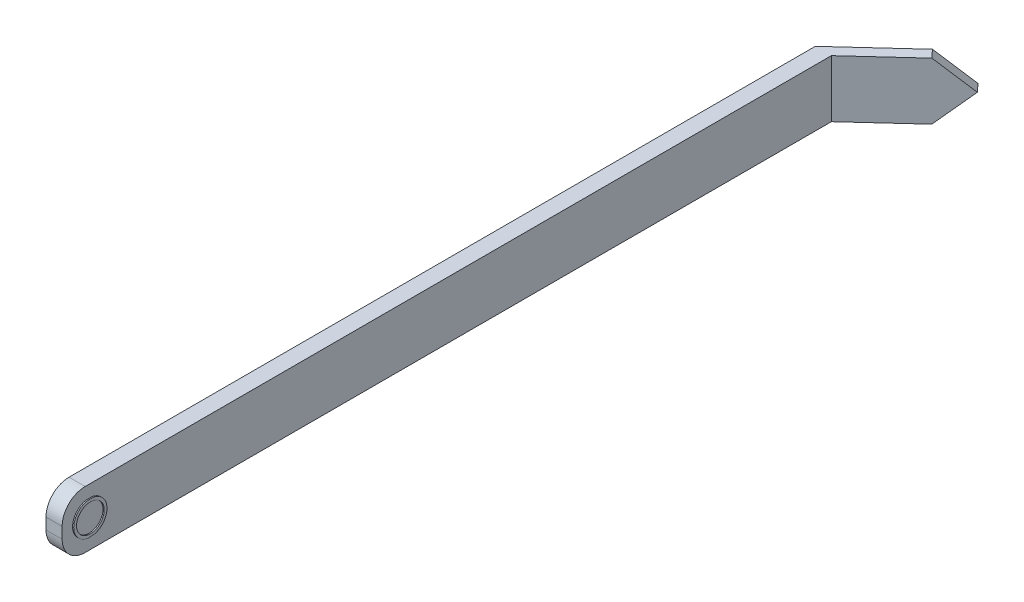
ISO-10303-21;
HEADER;
FILE_DESCRIPTION(('STEP AP214'),'2;1');
FILE_NAME('part.step','',(''),(''),'','','');
FILE_SCHEMA(('AUTOMOTIVE_DESIGN { 1 0 10303 214 1 1 1 1 }'));
ENDSEC;
DATA;
#1=APPLICATION_CONTEXT('core data for automotive mechanical design processes');
#2=APPLICATION_PROTOCOL_DEFINITION('international standard','automotive_design',2000,#1);
#3=PRODUCT_CONTEXT('',#1,'mechanical');
#4=PRODUCT('Part','Part','',(#3));
#5=PRODUCT_RELATED_PRODUCT_CATEGORY('part','',(#4));
#6=PRODUCT_DEFINITION_FORMATION('','',#4);
#7=PRODUCT_DEFINITION_CONTEXT('part definition',#1,'design');
#8=PRODUCT_DEFINITION('design','',#6,#7);
#9=PRODUCT_DEFINITION_SHAPE('','',#8);
#10=(LENGTH_UNIT() NAMED_UNIT(*) SI_UNIT(.MILLI.,.METRE.));
#11=(NAMED_UNIT(*) PLANE_ANGLE_UNIT() SI_UNIT($,.RADIAN.));
#12=(NAMED_UNIT(*) SI_UNIT($,.STERADIAN.) SOLID_ANGLE_UNIT());
#13=UNCERTAINTY_MEASURE_WITH_UNIT(LENGTH_MEASURE(1.E-05),#10,'distance_accuracy_value','');
#14=(GEOMETRIC_REPRESENTATION_CONTEXT(3) GLOBAL_UNCERTAINTY_ASSIGNED_CONTEXT((#13)) GLOBAL_UNIT_ASSIGNED_CONTEXT((#10,
#11,#12)) REPRESENTATION_CONTEXT('',''));
#15=CARTESIAN_POINT('',(0.,0.,0.));
#16=DIRECTION('',(0.,0.,1.));
#17=DIRECTION('',(1.,0.,0.));
#18=AXIS2_PLACEMENT_3D('',#15,#16,#17);
#19=CARTESIAN_POINT('',(3.49999999999998,6.21,-5.88));
#20=DIRECTION('',(-1.,0.,0.));
#21=DIRECTION('',(0.,-1.,0.));
#22=AXIS2_PLACEMENT_3D('',#19,#20,#21);
#23=PLANE('',#22);
#24=CARTESIAN_POINT('',(3.49999999999998,6.21,-5.88));
#25=DIRECTION('',(-1.,0.,0.));
#26=DIRECTION('',(0.,-1.,0.));
#27=AXIS2_PLACEMENT_3D('',#24,#25,#26);
#28=CIRCLE('',#27,3.61);
#29=CARTESIAN_POINT('',(3.49999999999998,2.62999999999999,-5.41556485921071));
#30=VERTEX_POINT('',#29);
#31=CARTESIAN_POINT('',(3.49999999999998,9.78999999999999,-5.41556485921069));
#32=VERTEX_POINT('',#31);
#33=EDGE_CURVE('E158',#30,#32,#28,.T.);
#34=ORIENTED_EDGE('',*,*,#33,.T.);
#35=DIRECTION('',(0.,-0.0596337664255842,-0.998220323326418));
#36=VECTOR('',#35,1.);
#37=CARTESIAN_POINT('',(3.49999999999998,9.74962212701801,-6.09145732482582));
#38=LINE('',#37,#36);
#39=CARTESIAN_POINT('',(3.49999999999998,9.70924425403603,-6.76734979044108));
#40=VERTEX_POINT('',#39);
#41=EDGE_CURVE('E153',#32,#40,#38,.T.);
#42=ORIENTED_EDGE('',*,*,#41,.T.);
#43=CARTESIAN_POINT('',(3.49999999999998,6.21,-5.88));
#44=DIRECTION('',(-1.,0.,0.));
#45=DIRECTION('',(0.,-1.,0.));
#46=AXIS2_PLACEMENT_3D('',#43,#44,#45);
#47=CIRCLE('',#46,3.61);
#48=CARTESIAN_POINT('',(3.49999999999998,2.71075574596396,-6.76734979044101));
#49=VERTEX_POINT('',#48);
#50=EDGE_CURVE('E156',#40,#49,#47,.T.);
#51=ORIENTED_EDGE('',*,*,#50,.T.);
#52=DIRECTION('',(0.,-0.0596337664255851,0.998220323326418));
#53=VECTOR('',#52,1.);
#54=CARTESIAN_POINT('',(3.49999999999998,2.67037787298197,-6.09145732482582));
#55=LINE('',#54,#53);
#56=EDGE_CURVE('E123',#49,#30,#55,.T.);
#57=ORIENTED_EDGE('',*,*,#56,.T.);
#58=EDGE_LOOP('',(#34,#42,#51,#57));
#59=FACE_BOUND('',#58,.T.);
#60=CARTESIAN_POINT('',(3.49999999999998,6.21,-5.88));
#61=DIRECTION('',(-1.,0.,0.));
#62=DIRECTION('',(0.,-1.,0.));
#63=AXIS2_PLACEMENT_3D('',#60,#61,#62);
#64=CIRCLE('',#63,3.);
#65=CARTESIAN_POINT('',(3.49999999999998,6.21,-8.88));
#66=VERTEX_POINT('',#65);
#67=EDGE_CURVE('E173',#66,#66,#64,.T.);
#68=ORIENTED_EDGE('',*,*,#67,.F.);
#69=EDGE_LOOP('',(#68));
#70=FACE_BOUND('',#69,.T.);
#71=ADVANCED_FACE('F106',(#59,#70),#23,.T.);
#72=CARTESIAN_POINT('',(3.74999999999998,6.21,-5.88));
#73=DIRECTION('',(-1.,0.,0.));
#74=DIRECTION('',(0.,-1.,0.));
#75=AXIS2_PLACEMENT_3D('',#72,#73,#74);
#76=PLANE('',#75);
#77=CARTESIAN_POINT('',(3.74999999999998,6.21,-5.88));
#78=DIRECTION('',(-1.,0.,0.));
#79=DIRECTION('',(0.,-1.,0.));
#80=AXIS2_PLACEMENT_3D('',#77,#78,#79);
#81=CIRCLE('',#80,3.61);
#82=CARTESIAN_POINT('',(3.74999999999998,2.62999999999999,-5.41556485921071));
#83=VERTEX_POINT('',#82);
#84=CARTESIAN_POINT('',(3.74999999999998,9.78999999999999,-5.41556485921069));
#85=VERTEX_POINT('',#84);
#86=EDGE_CURVE('E170',#83,#85,#81,.T.);
#87=ORIENTED_EDGE('',*,*,#86,.F.);
#88=DIRECTION('',(0.,-0.0596337664255851,0.998220323326418));
#89=VECTOR('',#88,1.);
#90=CARTESIAN_POINT('',(3.74999999999998,2.67037787298197,-6.09145732482582));
#91=LINE('',#90,#89);
#92=CARTESIAN_POINT('',(3.74999999999998,2.71075574596396,-6.76734979044101));
#93=VERTEX_POINT('',#92);
#94=EDGE_CURVE('E146',#93,#83,#91,.T.);
#95=ORIENTED_EDGE('',*,*,#94,.F.);
#96=CARTESIAN_POINT('',(3.74999999999998,6.21,-5.88));
#97=DIRECTION('',(-1.,0.,0.));
#98=DIRECTION('',(0.,-1.,0.));
#99=AXIS2_PLACEMENT_3D('',#96,#97,#98);
#100=CIRCLE('',#99,3.61);
#101=CARTESIAN_POINT('',(3.74999999999998,9.70924425403603,-6.76734979044108));
#102=VERTEX_POINT('',#101);
#103=EDGE_CURVE('E140',#102,#93,#100,.T.);
#104=ORIENTED_EDGE('',*,*,#103,.F.);
#105=DIRECTION('',(0.,-0.0596337664255842,-0.998220323326418));
#106=VECTOR('',#105,1.);
#107=CARTESIAN_POINT('',(3.74999999999998,9.74962212701801,-6.09145732482582));
#108=LINE('',#107,#106);
#109=EDGE_CURVE('E162',#85,#102,#108,.T.);
#110=ORIENTED_EDGE('',*,*,#109,.F.);
#111=EDGE_LOOP('',(#87,#95,#104,#110));
#112=FACE_BOUND('',#111,.T.);
#113=CARTESIAN_POINT('',(3.74999999999998,6.21,-5.88));
#114=DIRECTION('',(-1.,0.,0.));
#115=DIRECTION('',(0.,-1.,0.));
#116=AXIS2_PLACEMENT_3D('',#113,#114,#115);
#117=CIRCLE('',#116,3.);
#118=CARTESIAN_POINT('',(3.74999999999998,6.21,-8.88));
#119=VERTEX_POINT('',#118);
#120=EDGE_CURVE('E185',#119,#119,#117,.T.);
#121=ORIENTED_EDGE('',*,*,#120,.T.);
#122=EDGE_LOOP('',(#121));
#123=FACE_BOUND('',#122,.T.);
#124=ADVANCED_FACE('F181',(#112,#123),#76,.F.);
#125=CARTESIAN_POINT('',(3.49999999999998,6.21,-5.88));
#126=DIRECTION('',(1.,0.,0.));
#127=DIRECTION('',(0.,0.,-1.));
#128=AXIS2_PLACEMENT_3D('',#125,#126,#127);
#129=CYLINDRICAL_SURFACE('',#128,3.61);
#130=ORIENTED_EDGE('',*,*,#86,.T.);
#131=DIRECTION('',(1.,0.,0.));
#132=VECTOR('',#131,1.);
#133=CARTESIAN_POINT('',(3.49999999999998,9.78999999999999,-5.41556485921069));
#134=LINE('',#133,#132);
#135=EDGE_CURVE('E13',#32,#85,#134,.T.);
#136=ORIENTED_EDGE('',*,*,#135,.F.);
#137=ORIENTED_EDGE('',*,*,#33,.F.);
#138=DIRECTION('',(1.,0.,0.));
#139=VECTOR('',#138,1.);
#140=CARTESIAN_POINT('',(3.49999999999998,2.62999999999999,-5.41556485921071));
#141=LINE('',#140,#139);
#142=EDGE_CURVE('E166',#30,#83,#141,.T.);
#143=ORIENTED_EDGE('',*,*,#142,.T.);
#144=EDGE_LOOP('',(#130,#136,#137,#143));
#145=FACE_BOUND('',#144,.T.);
#146=ADVANCED_FACE('F108',(#145),#129,.T.);
#147=CARTESIAN_POINT('',(3.49999999999998,9.74962212701801,-6.09145732482582));
#148=DIRECTION('',(0.,-0.998220323326418,0.0596337664255842));
#149=DIRECTION('',(0.,-0.0596337664255842,-0.998220323326418));
#150=AXIS2_PLACEMENT_3D('',#147,#148,#149);
#151=PLANE('',#150);
#152=ORIENTED_EDGE('',*,*,#109,.T.);
#153=DIRECTION('',(1.,0.,0.));
#154=VECTOR('',#153,1.);
#155=CARTESIAN_POINT('',(3.49999999999998,9.70924425403603,-6.76734979044108));
#156=LINE('',#155,#154);
#157=EDGE_CURVE('E115',#40,#102,#156,.T.);
#158=ORIENTED_EDGE('',*,*,#157,.F.);
#159=ORIENTED_EDGE('',*,*,#41,.F.);
#160=ORIENTED_EDGE('',*,*,#135,.T.);
#161=EDGE_LOOP('',(#152,#158,#159,#160));
#162=FACE_BOUND('',#161,.T.);
#163=ADVANCED_FACE('F161',(#162),#151,.F.);
#164=CARTESIAN_POINT('',(3.49999999999998,6.21,-5.88));
#165=DIRECTION('',(1.,0.,0.));
#166=DIRECTION('',(0.,0.,-1.));
#167=AXIS2_PLACEMENT_3D('',#164,#165,#166);
#168=CYLINDRICAL_SURFACE('',#167,3.61);
#169=ORIENTED_EDGE('',*,*,#103,.T.);
#170=DIRECTION('',(1.,0.,0.));
#171=VECTOR('',#170,1.);
#172=CARTESIAN_POINT('',(3.49999999999998,2.71075574596396,-6.76734979044101));
#173=LINE('',#172,#171);
#174=EDGE_CURVE('E163',#49,#93,#173,.T.);
#175=ORIENTED_EDGE('',*,*,#174,.F.);
#176=ORIENTED_EDGE('',*,*,#50,.F.);
#177=ORIENTED_EDGE('',*,*,#157,.T.);
#178=EDGE_LOOP('',(#169,#175,#176,#177));
#179=FACE_BOUND('',#178,.T.);
#180=ADVANCED_FACE('F164',(#179),#168,.T.);
#181=CARTESIAN_POINT('',(3.49999999999998,2.67037787298197,-6.09145732482582));
#182=DIRECTION('',(0.,0.998220323326418,0.0596337664255851));
#183=DIRECTION('',(0.,-0.0596337664255851,0.998220323326418));
#184=AXIS2_PLACEMENT_3D('',#181,#182,#183);
#185=PLANE('',#184);
#186=ORIENTED_EDGE('',*,*,#94,.T.);
#187=ORIENTED_EDGE('',*,*,#142,.F.);
#188=ORIENTED_EDGE('',*,*,#56,.F.);
#189=ORIENTED_EDGE('',*,*,#174,.T.);
#190=EDGE_LOOP('',(#186,#187,#188,#189));
#191=FACE_BOUND('',#190,.T.);
#192=ADVANCED_FACE('F178',(#191),#185,.F.);
#193=CARTESIAN_POINT('',(3.49999999999998,6.21,-5.88));
#194=DIRECTION('',(1.,0.,0.));
#195=DIRECTION('',(0.,0.,-1.));
#196=AXIS2_PLACEMENT_3D('',#193,#194,#195);
#197=CYLINDRICAL_SURFACE('',#196,3.);
#198=CARTESIAN_POINT('',(3.49999999999998,6.21,-8.88));
#199=CARTESIAN_POINT('',(3.50260416666665,6.21,-8.88));
#200=CARTESIAN_POINT('',(3.50520833333332,6.21,-8.88));
#201=CARTESIAN_POINT('',(3.51041666666665,6.21,-8.88));
#202=CARTESIAN_POINT('',(3.51302083333332,6.21,-8.88));
#203=CARTESIAN_POINT('',(3.51822916666665,6.21,-8.88));
#204=CARTESIAN_POINT('',(3.52083333333332,6.21,-8.88));
#205=CARTESIAN_POINT('',(3.52604166666665,6.21,-8.88));
#206=CARTESIAN_POINT('',(3.52864583333332,6.21,-8.88));
#207=CARTESIAN_POINT('',(3.53385416666665,6.21,-8.88));
#208=CARTESIAN_POINT('',(3.53645833333332,6.21,-8.88));
#209=CARTESIAN_POINT('',(3.54166666666665,6.21,-8.88));
#210=CARTESIAN_POINT('',(3.54427083333332,6.21,-8.88));
#211=CARTESIAN_POINT('',(3.54947916666665,6.21,-8.88));
#212=CARTESIAN_POINT('',(3.55208333333332,6.21,-8.88));
#213=CARTESIAN_POINT('',(3.55729166666665,6.21,-8.88));
#214=CARTESIAN_POINT('',(3.55989583333332,6.21,-8.88));
#215=CARTESIAN_POINT('',(3.56510416666665,6.21,-8.88));
#216=CARTESIAN_POINT('',(3.56770833333332,6.21,-8.88));
#217=CARTESIAN_POINT('',(3.57291666666665,6.21,-8.88));
#218=CARTESIAN_POINT('',(3.57552083333332,6.21,-8.88));
#219=CARTESIAN_POINT('',(3.58072916666665,6.21,-8.88));
#220=CARTESIAN_POINT('',(3.58333333333332,6.21,-8.88));
#221=CARTESIAN_POINT('',(3.58854166666665,6.21,-8.88));
#222=CARTESIAN_POINT('',(3.59114583333332,6.21,-8.88));
#223=CARTESIAN_POINT('',(3.59635416666665,6.21,-8.88));
#224=CARTESIAN_POINT('',(3.59895833333332,6.21,-8.88));
#225=CARTESIAN_POINT('',(3.60416666666665,6.21,-8.88));
#226=CARTESIAN_POINT('',(3.60677083333332,6.21,-8.88));
#227=CARTESIAN_POINT('',(3.61197916666665,6.21,-8.88));
#228=CARTESIAN_POINT('',(3.61458333333332,6.21,-8.88));
#229=CARTESIAN_POINT('',(3.61979166666665,6.21,-8.88));
#230=CARTESIAN_POINT('',(3.62239583333332,6.21,-8.88));
#231=CARTESIAN_POINT('',(3.62760416666665,6.21,-8.88));
#232=CARTESIAN_POINT('',(3.63020833333332,6.21,-8.88));
#233=CARTESIAN_POINT('',(3.63541666666665,6.21,-8.88));
#234=CARTESIAN_POINT('',(3.63802083333332,6.21,-8.88));
#235=CARTESIAN_POINT('',(3.64322916666665,6.21,-8.88));
#236=CARTESIAN_POINT('',(3.64583333333332,6.21,-8.88));
#237=CARTESIAN_POINT('',(3.65104166666665,6.21,-8.88));
#238=CARTESIAN_POINT('',(3.65364583333332,6.21,-8.88));
#239=CARTESIAN_POINT('',(3.65885416666665,6.21,-8.88));
#240=CARTESIAN_POINT('',(3.66145833333332,6.21,-8.88));
#241=CARTESIAN_POINT('',(3.66666666666665,6.21,-8.88));
#242=CARTESIAN_POINT('',(3.66927083333332,6.21,-8.88));
#243=CARTESIAN_POINT('',(3.67447916666665,6.21,-8.88));
#244=CARTESIAN_POINT('',(3.67708333333332,6.21,-8.88));
#245=CARTESIAN_POINT('',(3.68229166666665,6.21,-8.88));
#246=CARTESIAN_POINT('',(3.68489583333332,6.21,-8.88));
#247=CARTESIAN_POINT('',(3.69010416666665,6.21,-8.88));
#248=CARTESIAN_POINT('',(3.69270833333332,6.21,-8.88));
#249=CARTESIAN_POINT('',(3.69791666666665,6.21,-8.88));
#250=CARTESIAN_POINT('',(3.70052083333332,6.21,-8.88));
#251=CARTESIAN_POINT('',(3.70572916666665,6.21,-8.88));
#252=CARTESIAN_POINT('',(3.70833333333332,6.21,-8.88));
#253=CARTESIAN_POINT('',(3.71354166666665,6.21,-8.88));
#254=CARTESIAN_POINT('',(3.71614583333332,6.21,-8.88));
#255=CARTESIAN_POINT('',(3.72135416666665,6.21,-8.88));
#256=CARTESIAN_POINT('',(3.72395833333332,6.21,-8.88));
#257=CARTESIAN_POINT('',(3.72916666666665,6.21,-8.88));
#258=CARTESIAN_POINT('',(3.73177083333332,6.21,-8.88));
#259=CARTESIAN_POINT('',(3.73697916666665,6.21,-8.88));
#260=CARTESIAN_POINT('',(3.73958333333332,6.21,-8.88));
#261=CARTESIAN_POINT('',(3.74479166666665,6.21,-8.88));
#262=CARTESIAN_POINT('',(3.74739583333332,6.21,-8.88));
#263=CARTESIAN_POINT('',(3.74999999999998,6.21,-8.88));
#264=B_SPLINE_CURVE_WITH_KNOTS('',3,(#198,#199,#200,#201,#202,#203,#204,#205,#206,#207,#208,
#209,#210,#211,#212,#213,#214,#215,#216,#217,#218,#219,#220,#221,#222,#223,#224,#225,#226,#227,
#228,#229,#230,#231,#232,#233,#234,#235,#236,#237,#238,#239,#240,#241,#242,#243,#244,#245,#246,
#247,#248,#249,#250,#251,#252,#253,#254,#255,#256,#257,#258,#259,#260,#261,#262,#263),
.UNSPECIFIED.,.F.,.F.,(4,2,2,2,2,2,2,2,2,2,2,2,2,2,2,2,2,2,2,2,2,2,2,2,2,2,2,2,2,2,2,2,4),(0.,
0.00781250000000044,0.0156250000000004,0.0234375000000005,0.0312500000000005,0.0390625000000005,
0.0468750000000005,0.0546875000000005,0.0625000000000005,0.0703125000000005,0.0781250000000005,
0.0859375000000005,0.0937500000000005,0.101562500000001,0.109375000000001,0.117187500000001,
0.125000000000001,0.132812500000001,0.140625000000001,0.148437500000001,0.156250000000001,
0.164062500000001,0.171875000000001,0.179687500000001,0.187500000000001,0.195312500000001,
0.203125000000001,0.210937500000001,0.218750000000001,0.226562500000001,0.234375000000001,
0.242187500000001,0.250000000000001),.UNSPECIFIED.);
#265=EDGE_CURVE('BSEAM191',#66,#119,#264,.T.);
#266=ORIENTED_EDGE('',*,*,#67,.T.);
#267=ORIENTED_EDGE('',*,*,#120,.F.);
#268=ORIENTED_EDGE('',*,*,#265,.T.);
#269=ORIENTED_EDGE('',*,*,#265,.F.);
#270=EDGE_LOOP('',(#266,#268,#267,#269));
#271=FACE_BOUND('',#270,.T.);
#272=ADVANCED_FACE('F191',(#271),#197,.F.);
#273=CLOSED_SHELL('',(#71,#124,#146,#163,#180,#192,#272));
#274=MANIFOLD_SOLID_BREP('B2',#273);
#275=CARTESIAN_POINT('',(3.5,0.,0.));
#276=DIRECTION('',(0.,1.,0.));
#277=DIRECTION('',(0.,0.,1.));
#278=AXIS2_PLACEMENT_3D('',#275,#276,#277);
#279=PLANE('',#278);
#280=DIRECTION('',(-0.737041466427065,0.,0.67584752479168));
#281=VECTOR('',#280,1.);
#282=CARTESIAN_POINT('',(18.4260366606766,0.,-183.896188119792));
#283=LINE('',#282,#281);
#284=CARTESIAN_POINT('',(13.2667463956872,0.,-179.16525544625));
#285=VERTEX_POINT('',#284);
#286=CARTESIAN_POINT('',(0.,0.,-167.));
#287=VERTEX_POINT('',#286);
#288=EDGE_CURVE('E486',#285,#287,#283,.T.);
#289=ORIENTED_EDGE('',*,*,#288,.F.);
#290=DIRECTION('',(-0.67584752479168,0.,-0.737041466427066));
#291=VECTOR('',#290,1.);
#292=CARTESIAN_POINT('',(105.600758087461,0.,-78.4709525420927));
#293=LINE('',#292,#291);
#294=CARTESIAN_POINT('',(14.8654409643718,0.,-177.421808668613));
#295=VERTEX_POINT('',#294);
#296=EDGE_CURVE('E393',#295,#285,#293,.T.);
#297=ORIENTED_EDGE('',*,*,#296,.F.);
#298=DIRECTION('',(0.737041466427065,0.,-0.67584752479168));
#299=VECTOR('',#298,1.);
#300=CARTESIAN_POINT('',(3.5,0.,-167.));
#301=LINE('',#300,#299);
#302=CARTESIAN_POINT('',(3.5,0.,-167.));
#303=VERTEX_POINT('',#302);
#304=EDGE_CURVE('E392',#303,#295,#301,.T.);
#305=ORIENTED_EDGE('',*,*,#304,.F.);
#306=DIRECTION('',(0.,0.,-1.));
#307=VECTOR('',#306,1.);
#308=CARTESIAN_POINT('',(3.5,0.,0.));
#309=LINE('',#308,#307);
#310=CARTESIAN_POINT('',(3.5,0.,-5.));
#311=VERTEX_POINT('',#310);
#312=EDGE_CURVE('E501',#311,#303,#309,.T.);
#313=ORIENTED_EDGE('',*,*,#312,.F.);
#314=DIRECTION('',(-1.,0.,0.));
#315=VECTOR('',#314,1.);
#316=CARTESIAN_POINT('',(0.,0.,-5.));
#317=LINE('',#316,#315);
#318=CARTESIAN_POINT('',(0.,0.,-5.));
#319=VERTEX_POINT('',#318);
#320=EDGE_CURVE('E546',#311,#319,#317,.T.);
#321=ORIENTED_EDGE('',*,*,#320,.T.);
#322=DIRECTION('',(0.,0.,-1.));
#323=VECTOR('',#322,1.);
#324=CARTESIAN_POINT('',(0.,0.,0.));
#325=LINE('',#324,#323);
#326=EDGE_CURVE('E505',#319,#287,#325,.T.);
#327=ORIENTED_EDGE('',*,*,#326,.T.);
#328=EDGE_LOOP('',(#289,#297,#305,#313,#321,#327));
#329=FACE_BOUND('',#328,.T.);
#330=ADVANCED_FACE('F259',(#329),#279,.F.);
#331=CARTESIAN_POINT('',(3.5,12.42,0.));
#332=DIRECTION('',(0.,1.,0.));
#333=DIRECTION('',(0.,0.,1.));
#334=AXIS2_PLACEMENT_3D('',#331,#332,#333);
#335=PLANE('',#334);
#336=DIRECTION('',(-0.67584752479168,0.,-0.737041466427066));
#337=VECTOR('',#336,1.);
#338=CARTESIAN_POINT('',(105.600758087461,12.42,-78.4709525420926));
#339=LINE('',#338,#337);
#340=CARTESIAN_POINT('',(14.8654409643718,12.42,-177.421808668613));
#341=VERTEX_POINT('',#340);
#342=CARTESIAN_POINT('',(13.2667463956871,12.42,-179.16525544625));
#343=VERTEX_POINT('',#342);
#344=EDGE_CURVE('E273',#341,#343,#339,.T.);
#345=ORIENTED_EDGE('',*,*,#344,.T.);
#346=DIRECTION('',(-0.737041466427065,0.,0.67584752479168));
#347=VECTOR('',#346,1.);
#348=CARTESIAN_POINT('',(18.4260366606766,12.42,-183.896188119792));
#349=LINE('',#348,#347);
#350=CARTESIAN_POINT('',(0.,12.42,-167.));
#351=VERTEX_POINT('',#350);
#352=EDGE_CURVE('E485',#343,#351,#349,.T.);
#353=ORIENTED_EDGE('',*,*,#352,.T.);
#354=DIRECTION('',(0.,0.,-1.));
#355=VECTOR('',#354,1.);
#356=CARTESIAN_POINT('',(0.,12.42,0.));
#357=LINE('',#356,#355);
#358=CARTESIAN_POINT('',(0.,12.42,-5.));
#359=VERTEX_POINT('',#358);
#360=EDGE_CURVE('E491',#359,#351,#357,.T.);
#361=ORIENTED_EDGE('',*,*,#360,.F.);
#362=DIRECTION('',(-1.,0.,0.));
#363=VECTOR('',#362,1.);
#364=CARTESIAN_POINT('',(3.5,12.42,-5.));
#365=LINE('',#364,#363);
#366=CARTESIAN_POINT('',(3.5,12.42,-5.));
#367=VERTEX_POINT('',#366);
#368=EDGE_CURVE('E540',#359,#367,#365,.F.);
#369=ORIENTED_EDGE('',*,*,#368,.T.);
#370=DIRECTION('',(0.,0.,-1.));
#371=VECTOR('',#370,1.);
#372=CARTESIAN_POINT('',(3.5,12.42,0.));
#373=LINE('',#372,#371);
#374=CARTESIAN_POINT('',(3.5,12.42,-167.));
#375=VERTEX_POINT('',#374);
#376=EDGE_CURVE('E507',#367,#375,#373,.T.);
#377=ORIENTED_EDGE('',*,*,#376,.T.);
#378=DIRECTION('',(0.737041466427065,0.,-0.67584752479168));
#379=VECTOR('',#378,1.);
#380=CARTESIAN_POINT('',(3.5,12.42,-167.));
#381=LINE('',#380,#379);
#382=EDGE_CURVE('E591',#375,#341,#381,.T.);
#383=ORIENTED_EDGE('',*,*,#382,.T.);
#384=EDGE_LOOP('',(#345,#353,#361,#369,#377,#383));
#385=FACE_BOUND('',#384,.T.);
#386=ADVANCED_FACE('F408',(#385),#335,.T.);
#387=CARTESIAN_POINT('',(3.5,0.,0.));
#388=DIRECTION('',(1.,0.,0.));
#389=DIRECTION('',(0.,0.,-1.));
#390=AXIS2_PLACEMENT_3D('',#387,#388,#389);
#391=PLANE('',#390);
#392=DIRECTION('',(0.,-0.0596337664255842,-0.998220323326418));
#393=VECTOR('',#392,1.);
#394=CARTESIAN_POINT('',(3.5,10.0775607204516,-0.602034328594348));
#395=LINE('',#394,#393);
#396=CARTESIAN_POINT('',(3.5,9.78999999999999,-5.41556485921069));
#397=VERTEX_POINT('',#396);
#398=CARTESIAN_POINT('',(3.5,9.72280735048438,-6.54031468376415));
#399=VERTEX_POINT('',#398);
#400=EDGE_CURVE('E512',#397,#399,#395,.T.);
#401=ORIENTED_EDGE('',*,*,#400,.T.);
#402=CARTESIAN_POINT('',(3.5,7.72636670383154,-6.42104715091298));
#403=DIRECTION('',(1.,0.,0.));
#404=DIRECTION('',(0.,0.,-1.));
#405=AXIS2_PLACEMENT_3D('',#402,#403,#404);
#406=CIRCLE('',#405,2.);
#407=CARTESIAN_POINT('',(3.5,9.61005205020613,-7.09315541291669));
#408=VERTEX_POINT('',#407);
#409=EDGE_CURVE('E474',#399,#408,#406,.F.);
#410=ORIENTED_EDGE('',*,*,#409,.T.);
#411=CARTESIAN_POINT('',(3.5,6.21,-5.88));
#412=DIRECTION('',(-1.,0.,0.));
#413=DIRECTION('',(0.,0.,1.));
#414=AXIS2_PLACEMENT_3D('',#411,#412,#413);
#415=CIRCLE('',#414,3.61);
#416=CARTESIAN_POINT('',(3.5,2.80994794979383,-7.09315541291659));
#417=VERTEX_POINT('',#416);
#418=EDGE_CURVE('E529',#408,#417,#415,.T.);
#419=ORIENTED_EDGE('',*,*,#418,.T.);
#420=CARTESIAN_POINT('',(3.5,4.69363329616844,-6.42104715091294));
#421=DIRECTION('',(1.,0.,0.));
#422=DIRECTION('',(0.,0.,-1.));
#423=AXIS2_PLACEMENT_3D('',#420,#421,#422);
#424=CIRCLE('',#423,2.);
#425=CARTESIAN_POINT('',(3.5,2.69719264951561,-6.54031468376411));
#426=VERTEX_POINT('',#425);
#427=EDGE_CURVE('E464',#417,#426,#424,.F.);
#428=ORIENTED_EDGE('',*,*,#427,.T.);
#429=DIRECTION('',(0.,-0.0596337664255851,0.998220323326418));
#430=VECTOR('',#429,1.);
#431=CARTESIAN_POINT('',(3.5,2.29827144820995,0.137298930428936));
#432=LINE('',#431,#430);
#433=CARTESIAN_POINT('',(3.5,2.62999999999999,-5.41556485921071));
#434=VERTEX_POINT('',#433);
#435=EDGE_CURVE('E527',#426,#434,#432,.T.);
#436=ORIENTED_EDGE('',*,*,#435,.T.);
#437=EDGE_CURVE('E517',#434,#397,#415,.T.);
#438=ORIENTED_EDGE('',*,*,#437,.T.);
#439=EDGE_LOOP('',(#401,#410,#419,#428,#436,#438));
#440=FACE_BOUND('',#439,.T.);
#441=ORIENTED_EDGE('',*,*,#312,.T.);
#442=DIRECTION('',(0.,1.,0.));
#443=VECTOR('',#442,1.);
#444=CARTESIAN_POINT('',(3.5,0.,-167.));
#445=LINE('',#444,#443);
#446=EDGE_CURVE('E567',#303,#375,#445,.T.);
#447=ORIENTED_EDGE('',*,*,#446,.T.);
#448=ORIENTED_EDGE('',*,*,#376,.F.);
#449=CARTESIAN_POINT('',(3.5,7.42,-5.));
#450=DIRECTION('',(1.,0.,0.));
#451=DIRECTION('',(0.,0.,-1.));
#452=AXIS2_PLACEMENT_3D('',#449,#450,#451);
#453=CIRCLE('',#452,5.);
#454=CARTESIAN_POINT('',(3.5,7.42,0.));
#455=VERTEX_POINT('',#454);
#456=EDGE_CURVE('E544',#367,#455,#453,.T.);
#457=ORIENTED_EDGE('',*,*,#456,.T.);
#458=DIRECTION('',(0.,1.,0.));
#459=VECTOR('',#458,1.);
#460=CARTESIAN_POINT('',(3.5,0.,0.));
#461=LINE('',#460,#459);
#462=CARTESIAN_POINT('',(3.5,5.,0.));
#463=VERTEX_POINT('',#462);
#464=EDGE_CURVE('E509',#463,#455,#461,.T.);
#465=ORIENTED_EDGE('',*,*,#464,.F.);
#466=CARTESIAN_POINT('',(3.5,5.,-5.));
#467=DIRECTION('',(1.,0.,0.));
#468=DIRECTION('',(0.,0.,-1.));
#469=AXIS2_PLACEMENT_3D('',#466,#467,#468);
#470=CIRCLE('',#469,5.);
#471=EDGE_CURVE('E542',#463,#311,#470,.T.);
#472=ORIENTED_EDGE('',*,*,#471,.T.);
#473=EDGE_LOOP('',(#441,#447,#448,#457,#465,#472));
#474=FACE_BOUND('',#473,.T.);
#475=ADVANCED_FACE('F415',(#440,#474),#391,.T.);
#476=CARTESIAN_POINT('',(0.,0.,0.));
#477=DIRECTION('',(1.,0.,0.));
#478=DIRECTION('',(0.,0.,-1.));
#479=AXIS2_PLACEMENT_3D('',#476,#477,#478);
#480=PLANE('',#479);
#481=DIRECTION('',(0.,-0.0596337664255851,0.998220323326418));
#482=VECTOR('',#481,1.);
#483=CARTESIAN_POINT('',(0.,2.29827144820995,0.137298930428936));
#484=LINE('',#483,#482);
#485=CARTESIAN_POINT('',(0.,3.705,-23.410182873402));
#486=VERTEX_POINT('',#485);
#487=CARTESIAN_POINT('',(0.,2.62999999999999,-5.41556485921071));
#488=VERTEX_POINT('',#487);
#489=EDGE_CURVE('E495',#486,#488,#484,.T.);
#490=ORIENTED_EDGE('',*,*,#489,.F.);
#491=CARTESIAN_POINT('',(0.,6.21,-23.2605339618287));
#492=DIRECTION('',(-1.,0.,0.));
#493=DIRECTION('',(0.,0.,1.));
#494=AXIS2_PLACEMENT_3D('',#491,#492,#493);
#495=CIRCLE('',#494,2.50946603817128);
#496=CARTESIAN_POINT('',(0.,8.715,-23.410182873402));
#497=VERTEX_POINT('',#496);
#498=EDGE_CURVE('E566',#497,#486,#495,.T.);
#499=ORIENTED_EDGE('',*,*,#498,.F.);
#500=DIRECTION('',(0.,-0.0596337664255842,-0.998220323326418));
#501=VECTOR('',#500,1.);
#502=CARTESIAN_POINT('',(0.,10.0775607204516,-0.602034328594348));
#503=LINE('',#502,#501);
#504=CARTESIAN_POINT('',(0.,9.78999999999999,-5.41556485921069));
#505=VERTEX_POINT('',#504);
#506=EDGE_CURVE('E520',#505,#497,#503,.T.);
#507=ORIENTED_EDGE('',*,*,#506,.F.);
#508=CARTESIAN_POINT('',(0.,6.21,-5.88));
#509=DIRECTION('',(-1.,0.,0.));
#510=DIRECTION('',(0.,0.,1.));
#511=AXIS2_PLACEMENT_3D('',#508,#509,#510);
#512=CIRCLE('',#511,3.61);
#513=EDGE_CURVE('E499',#488,#505,#512,.T.);
#514=ORIENTED_EDGE('',*,*,#513,.F.);
#515=EDGE_LOOP('',(#490,#499,#507,#514));
#516=FACE_BOUND('',#515,.T.);
#517=DIRECTION('',(0.,1.,0.));
#518=VECTOR('',#517,1.);
#519=CARTESIAN_POINT('',(0.,0.,-167.));
#520=LINE('',#519,#518);
#521=EDGE_CURVE('E267',#287,#351,#520,.T.);
#522=ORIENTED_EDGE('',*,*,#521,.F.);
#523=ORIENTED_EDGE('',*,*,#326,.F.);
#524=CARTESIAN_POINT('',(0.,5.,-5.));
#525=DIRECTION('',(1.,0.,0.));
#526=DIRECTION('',(0.,0.,-1.));
#527=AXIS2_PLACEMENT_3D('',#524,#525,#526);
#528=CIRCLE('',#527,5.);
#529=CARTESIAN_POINT('',(0.,5.,0.));
#530=VERTEX_POINT('',#529);
#531=EDGE_CURVE('E537',#319,#530,#528,.F.);
#532=ORIENTED_EDGE('',*,*,#531,.T.);
#533=DIRECTION('',(0.,1.,0.));
#534=VECTOR('',#533,1.);
#535=CARTESIAN_POINT('',(0.,0.,0.));
#536=LINE('',#535,#534);
#537=CARTESIAN_POINT('',(0.,7.42,0.));
#538=VERTEX_POINT('',#537);
#539=EDGE_CURVE('E496',#530,#538,#536,.T.);
#540=ORIENTED_EDGE('',*,*,#539,.T.);
#541=CARTESIAN_POINT('',(0.,7.42,-5.));
#542=DIRECTION('',(1.,0.,0.));
#543=DIRECTION('',(0.,0.,-1.));
#544=AXIS2_PLACEMENT_3D('',#541,#542,#543);
#545=CIRCLE('',#544,5.);
#546=EDGE_CURVE('E493',#538,#359,#545,.F.);
#547=ORIENTED_EDGE('',*,*,#546,.T.);
#548=ORIENTED_EDGE('',*,*,#360,.T.);
#549=EDGE_LOOP('',(#522,#523,#532,#540,#547,#548));
#550=FACE_BOUND('',#549,.T.);
#551=ADVANCED_FACE('F427',(#516,#550),#480,.F.);
#552=CARTESIAN_POINT('',(3.5,0.,0.));
#553=DIRECTION('',(0.,0.,1.));
#554=DIRECTION('',(1.,0.,0.));
#555=AXIS2_PLACEMENT_3D('',#552,#553,#554);
#556=PLANE('',#555);
#557=ORIENTED_EDGE('',*,*,#464,.T.);
#558=DIRECTION('',(-1.,0.,0.));
#559=VECTOR('',#558,1.);
#560=CARTESIAN_POINT('',(3.5,7.42,0.));
#561=LINE('',#560,#559);
#562=EDGE_CURVE('E534',#455,#538,#561,.T.);
#563=ORIENTED_EDGE('',*,*,#562,.T.);
#564=ORIENTED_EDGE('',*,*,#539,.F.);
#565=DIRECTION('',(-1.,0.,0.));
#566=VECTOR('',#565,1.);
#567=CARTESIAN_POINT('',(3.5,5.,0.));
#568=LINE('',#567,#566);
#569=EDGE_CURVE('E522',#530,#463,#568,.F.);
#570=ORIENTED_EDGE('',*,*,#569,.T.);
#571=EDGE_LOOP('',(#557,#563,#564,#570));
#572=FACE_BOUND('',#571,.T.);
#573=ADVANCED_FACE('F423',(#572),#556,.T.);
#574=CARTESIAN_POINT('',(3.5,6.21,-5.88));
#575=DIRECTION('',(-1.,0.,0.));
#576=DIRECTION('',(0.,0.,1.));
#577=AXIS2_PLACEMENT_3D('',#574,#575,#576);
#578=CYLINDRICAL_SURFACE('',#577,3.61);
#579=CARTESIAN_POINT('',(1.8,6.21,-5.88));
#580=DIRECTION('',(1.,0.,0.));
#581=DIRECTION('',(0.,0.,-1.));
#582=AXIS2_PLACEMENT_3D('',#579,#580,#581);
#583=CIRCLE('',#582,3.61);
#584=CARTESIAN_POINT('',(1.8,9.61005205020613,-7.09315541291669));
#585=VERTEX_POINT('',#584);
#586=CARTESIAN_POINT('',(1.8,2.80994794979383,-7.09315541291659));
#587=VERTEX_POINT('',#586);
#588=EDGE_CURVE('E564',#585,#587,#583,.F.);
#589=ORIENTED_EDGE('',*,*,#588,.T.);
#590=DIRECTION('',(-1.,0.,0.));
#591=VECTOR('',#590,1.);
#592=CARTESIAN_POINT('',(3.5,2.80994794979383,-7.09315541291659));
#593=LINE('',#592,#591);
#594=EDGE_CURVE('E466',#587,#417,#593,.F.);
#595=ORIENTED_EDGE('',*,*,#594,.T.);
#596=ORIENTED_EDGE('',*,*,#418,.F.);
#597=DIRECTION('',(-1.,0.,0.));
#598=VECTOR('',#597,1.);
#599=CARTESIAN_POINT('',(3.5,9.61005205020613,-7.09315541291669));
#600=LINE('',#599,#598);
#601=EDGE_CURVE('E550',#408,#585,#600,.T.);
#602=ORIENTED_EDGE('',*,*,#601,.T.);
#603=EDGE_LOOP('',(#589,#595,#596,#602));
#604=FACE_BOUND('',#603,.T.);
#605=ADVANCED_FACE('F426',(#604),#578,.F.);
#606=CARTESIAN_POINT('',(3.5,2.29827144820995,0.137298930428936));
#607=DIRECTION('',(0.,-0.998220323326418,-0.0596337664255851));
#608=DIRECTION('',(0.,0.0596337664255851,-0.998220323326418));
#609=AXIS2_PLACEMENT_3D('',#606,#607,#608);
#610=PLANE('',#609);
#611=ORIENTED_EDGE('',*,*,#435,.F.);
#612=DIRECTION('',(1.,0.,0.));
#613=VECTOR('',#612,1.);
#614=CARTESIAN_POINT('',(1.8,2.69719264951561,-6.54031468376411));
#615=LINE('',#614,#613);
#616=CARTESIAN_POINT('',(1.8,2.69719264951561,-6.54031468376411));
#617=VERTEX_POINT('',#616);
#618=EDGE_CURVE('E468',#426,#617,#615,.F.);
#619=ORIENTED_EDGE('',*,*,#618,.T.);
#620=DIRECTION('',(0.,-0.0596337664255851,0.998220323326418));
#621=VECTOR('',#620,1.);
#622=CARTESIAN_POINT('',(1.8,2.29827144820995,0.137298930428936));
#623=LINE('',#622,#621);
#624=CARTESIAN_POINT('',(1.8,3.705,-23.410182873402));
#625=VERTEX_POINT('',#624);
#626=EDGE_CURVE('E577',#625,#617,#623,.T.);
#627=ORIENTED_EDGE('',*,*,#626,.F.);
#628=DIRECTION('',(-1.,0.,0.));
#629=VECTOR('',#628,1.);
#630=CARTESIAN_POINT('',(23.7504211409163,3.705,-23.410182873402));
#631=LINE('',#630,#629);
#632=EDGE_CURVE('E579',#625,#486,#631,.T.);
#633=ORIENTED_EDGE('',*,*,#632,.T.);
#634=ORIENTED_EDGE('',*,*,#489,.T.);
#635=DIRECTION('',(-1.,0.,0.));
#636=VECTOR('',#635,1.);
#637=CARTESIAN_POINT('',(3.5,2.62999999999999,-5.41556485921071));
#638=LINE('',#637,#636);
#639=EDGE_CURVE('E518',#434,#488,#638,.T.);
#640=ORIENTED_EDGE('',*,*,#639,.F.);
#641=EDGE_LOOP('',(#611,#619,#627,#633,#634,#640));
#642=FACE_BOUND('',#641,.T.);
#643=ADVANCED_FACE('F433',(#642),#610,.F.);
#644=ORIENTED_EDGE('',*,*,#513,.T.);
#645=DIRECTION('',(-1.,0.,0.));
#646=VECTOR('',#645,1.);
#647=CARTESIAN_POINT('',(3.5,9.78999999999999,-5.41556485921069));
#648=LINE('',#647,#646);
#649=EDGE_CURVE('E521',#397,#505,#648,.T.);
#650=ORIENTED_EDGE('',*,*,#649,.F.);
#651=ORIENTED_EDGE('',*,*,#437,.F.);
#652=ORIENTED_EDGE('',*,*,#639,.T.);
#653=EDGE_LOOP('',(#644,#650,#651,#652));
#654=FACE_BOUND('',#653,.T.);
#655=ADVANCED_FACE('F432',(#654),#578,.F.);
#656=CARTESIAN_POINT('',(3.5,10.0775607204516,-0.602034328594348));
#657=DIRECTION('',(0.,0.998220323326418,-0.0596337664255842));
#658=DIRECTION('',(0.,0.0596337664255842,0.998220323326418));
#659=AXIS2_PLACEMENT_3D('',#656,#657,#658);
#660=PLANE('',#659);
#661=DIRECTION('',(0.,-0.0596337664255841,-0.998220323326418));
#662=VECTOR('',#661,1.);
#663=CARTESIAN_POINT('',(1.8,10.0775607204516,-0.602034328594348));
#664=LINE('',#663,#662);
#665=CARTESIAN_POINT('',(1.8,9.72280735048438,-6.54031468376415));
#666=VERTEX_POINT('',#665);
#667=CARTESIAN_POINT('',(1.8,8.715,-23.410182873402));
#668=VERTEX_POINT('',#667);
#669=EDGE_CURVE('E281',#666,#668,#664,.T.);
#670=ORIENTED_EDGE('',*,*,#669,.F.);
#671=DIRECTION('',(1.,0.,0.));
#672=VECTOR('',#671,1.);
#673=CARTESIAN_POINT('',(3.5,9.72280735048438,-6.54031468376415));
#674=LINE('',#673,#672);
#675=EDGE_CURVE('E476',#666,#399,#674,.T.);
#676=ORIENTED_EDGE('',*,*,#675,.T.);
#677=ORIENTED_EDGE('',*,*,#400,.F.);
#678=ORIENTED_EDGE('',*,*,#649,.T.);
#679=ORIENTED_EDGE('',*,*,#506,.T.);
#680=DIRECTION('',(-1.,0.,0.));
#681=VECTOR('',#680,1.);
#682=CARTESIAN_POINT('',(23.7504211409163,8.715,-23.410182873402));
#683=LINE('',#682,#681);
#684=EDGE_CURVE('E508',#668,#497,#683,.T.);
#685=ORIENTED_EDGE('',*,*,#684,.F.);
#686=EDGE_LOOP('',(#670,#676,#677,#678,#679,#685));
#687=FACE_BOUND('',#686,.T.);
#688=ADVANCED_FACE('F429',(#687),#660,.F.);
#689=CARTESIAN_POINT('',(1.8,0.,0.));
#690=DIRECTION('',(1.,0.,0.));
#691=DIRECTION('',(0.,0.,-1.));
#692=AXIS2_PLACEMENT_3D('',#689,#690,#691);
#693=PLANE('',#692);
#694=ORIENTED_EDGE('',*,*,#669,.T.);
#695=CARTESIAN_POINT('',(1.8,6.21,-23.2605339618287));
#696=DIRECTION('',(1.,0.,0.));
#697=DIRECTION('',(0.,0.,-1.));
#698=AXIS2_PLACEMENT_3D('',#695,#696,#697);
#699=CIRCLE('',#698,2.50946603817128);
#700=EDGE_CURVE('E570',#668,#625,#699,.F.);
#701=ORIENTED_EDGE('',*,*,#700,.T.);
#702=ORIENTED_EDGE('',*,*,#626,.T.);
#703=CARTESIAN_POINT('',(1.8,4.69363329616844,-6.42104715091294));
#704=DIRECTION('',(1.,0.,0.));
#705=DIRECTION('',(0.,0.,-1.));
#706=AXIS2_PLACEMENT_3D('',#703,#704,#705);
#707=CIRCLE('',#706,2.);
#708=EDGE_CURVE('E472',#617,#587,#707,.T.);
#709=ORIENTED_EDGE('',*,*,#708,.T.);
#710=ORIENTED_EDGE('',*,*,#588,.F.);
#711=CARTESIAN_POINT('',(1.8,7.72636670383154,-6.42104715091298));
#712=DIRECTION('',(1.,0.,0.));
#713=DIRECTION('',(0.,0.,-1.));
#714=AXIS2_PLACEMENT_3D('',#711,#712,#713);
#715=CIRCLE('',#714,2.);
#716=EDGE_CURVE('E471',#585,#666,#715,.T.);
#717=ORIENTED_EDGE('',*,*,#716,.T.);
#718=EDGE_LOOP('',(#694,#701,#702,#709,#710,#717));
#719=FACE_BOUND('',#718,.T.);
#720=ADVANCED_FACE('F420',(#719),#693,.F.);
#721=CARTESIAN_POINT('',(23.7504211409163,6.21,-23.2605339618287));
#722=DIRECTION('',(-1.,0.,0.));
#723=DIRECTION('',(0.,0.,1.));
#724=AXIS2_PLACEMENT_3D('',#721,#722,#723);
#725=CYLINDRICAL_SURFACE('',#724,2.50946603817128);
#726=ORIENTED_EDGE('',*,*,#684,.T.);
#727=ORIENTED_EDGE('',*,*,#498,.T.);
#728=ORIENTED_EDGE('',*,*,#632,.F.);
#729=ORIENTED_EDGE('',*,*,#700,.F.);
#730=EDGE_LOOP('',(#726,#727,#728,#729));
#731=FACE_BOUND('',#730,.T.);
#732=ADVANCED_FACE('F449',(#731),#725,.F.);
#733=CARTESIAN_POINT('',(3.5,7.42,-5.));
#734=DIRECTION('',(-1.,0.,0.));
#735=DIRECTION('',(0.,0.,1.));
#736=AXIS2_PLACEMENT_3D('',#733,#734,#735);
#737=CYLINDRICAL_SURFACE('',#736,5.);
#738=ORIENTED_EDGE('',*,*,#456,.F.);
#739=ORIENTED_EDGE('',*,*,#368,.F.);
#740=ORIENTED_EDGE('',*,*,#546,.F.);
#741=ORIENTED_EDGE('',*,*,#562,.F.);
#742=EDGE_LOOP('',(#738,#739,#740,#741));
#743=FACE_BOUND('',#742,.T.);
#744=ADVANCED_FACE('F445',(#743),#737,.T.);
#745=CARTESIAN_POINT('',(3.5,5.,-5.));
#746=DIRECTION('',(1.,0.,0.));
#747=DIRECTION('',(0.,0.,-1.));
#748=AXIS2_PLACEMENT_3D('',#745,#746,#747);
#749=CYLINDRICAL_SURFACE('',#748,5.);
#750=ORIENTED_EDGE('',*,*,#471,.F.);
#751=ORIENTED_EDGE('',*,*,#569,.F.);
#752=ORIENTED_EDGE('',*,*,#531,.F.);
#753=ORIENTED_EDGE('',*,*,#320,.F.);
#754=EDGE_LOOP('',(#750,#751,#752,#753));
#755=FACE_BOUND('',#754,.T.);
#756=ADVANCED_FACE('F448',(#755),#749,.T.);
#757=CARTESIAN_POINT('',(3.5,4.69363329616844,-6.42104715091294));
#758=DIRECTION('',(-1.,0.,0.));
#759=DIRECTION('',(0.,0.,1.));
#760=AXIS2_PLACEMENT_3D('',#757,#758,#759);
#761=CYLINDRICAL_SURFACE('',#760,2.);
#762=ORIENTED_EDGE('',*,*,#427,.F.);
#763=ORIENTED_EDGE('',*,*,#594,.F.);
#764=ORIENTED_EDGE('',*,*,#708,.F.);
#765=ORIENTED_EDGE('',*,*,#618,.F.);
#766=EDGE_LOOP('',(#762,#763,#764,#765));
#767=FACE_BOUND('',#766,.T.);
#768=ADVANCED_FACE('F452',(#767),#761,.F.);
#769=CARTESIAN_POINT('',(3.5,7.72636670383154,-6.42104715091298));
#770=DIRECTION('',(-1.,0.,0.));
#771=DIRECTION('',(0.,0.,1.));
#772=AXIS2_PLACEMENT_3D('',#769,#770,#771);
#773=CYLINDRICAL_SURFACE('',#772,2.);
#774=ORIENTED_EDGE('',*,*,#409,.F.);
#775=ORIENTED_EDGE('',*,*,#675,.F.);
#776=ORIENTED_EDGE('',*,*,#716,.F.);
#777=ORIENTED_EDGE('',*,*,#601,.F.);
#778=EDGE_LOOP('',(#774,#775,#776,#777));
#779=FACE_BOUND('',#778,.T.);
#780=ADVANCED_FACE('F261',(#779),#773,.F.);
#781=CARTESIAN_POINT('',(18.4260366606766,0.,-183.896188119792));
#782=DIRECTION('',(-0.67584752479168,0.,-0.737041466427065));
#783=DIRECTION('',(-0.737041466427065,0.,0.675847524791681));
#784=AXIS2_PLACEMENT_3D('',#781,#782,#783);
#785=PLANE('',#784);
#786=DIRECTION('',(0.551349415001228,0.663633889799109,-0.505572826492789));
#787=VECTOR('',#786,1.);
#788=CARTESIAN_POINT('',(16.15383394623,3.47505427452574,-181.812638346361));
#789=LINE('',#788,#787);
#790=CARTESIAN_POINT('',(18.4260366606766,6.20999999999994,-183.896188119792));
#791=VERTEX_POINT('',#790);
#792=EDGE_CURVE('E384',#285,#791,#789,.T.);
#793=ORIENTED_EDGE('',*,*,#792,.F.);
#794=ORIENTED_EDGE('',*,*,#288,.T.);
#795=ORIENTED_EDGE('',*,*,#521,.T.);
#796=ORIENTED_EDGE('',*,*,#352,.F.);
#797=DIRECTION('',(-0.551349415001228,0.663633889799109,0.505572826492789));
#798=VECTOR('',#797,1.);
#799=CARTESIAN_POINT('',(20.6982393751233,3.47505427452573,-185.979737893224));
#800=LINE('',#799,#798);
#801=EDGE_CURVE('E396',#791,#343,#800,.T.);
#802=ORIENTED_EDGE('',*,*,#801,.F.);
#803=EDGE_LOOP('',(#793,#794,#795,#796,#802));
#804=FACE_BOUND('',#803,.T.);
#805=ADVANCED_FACE('F404',(#804),#785,.T.);
#806=CARTESIAN_POINT('',(3.5,0.,-167.));
#807=DIRECTION('',(0.67584752479168,0.,0.737041466427065));
#808=DIRECTION('',(0.737041466427065,0.,-0.675847524791681));
#809=AXIS2_PLACEMENT_3D('',#806,#807,#808);
#810=PLANE('',#809);
#811=DIRECTION('',(-0.551349415001228,-0.663633889799109,0.505572826492789));
#812=VECTOR('',#811,1.);
#813=CARTESIAN_POINT('',(8.50545316966808,-7.65522429957546,-171.589868127203));
#814=LINE('',#813,#812);
#815=CARTESIAN_POINT('',(20.0247312293613,6.20999999999994,-182.152741342155));
#816=VERTEX_POINT('',#815);
#817=EDGE_CURVE('E381',#816,#295,#814,.T.);
#818=ORIENTED_EDGE('',*,*,#817,.F.);
#819=DIRECTION('',(0.551349415001228,-0.663633889799109,-0.505572826492789));
#820=VECTOR('',#819,1.);
#821=CARTESIAN_POINT('',(13.0498585985614,14.6053328486269,-175.756967674066));
#822=LINE('',#821,#820);
#823=EDGE_CURVE('E104',#341,#816,#822,.T.);
#824=ORIENTED_EDGE('',*,*,#823,.F.);
#825=ORIENTED_EDGE('',*,*,#382,.F.);
#826=ORIENTED_EDGE('',*,*,#446,.F.);
#827=ORIENTED_EDGE('',*,*,#304,.T.);
#828=EDGE_LOOP('',(#818,#824,#825,#826,#827));
#829=FACE_BOUND('',#828,.T.);
#830=ADVANCED_FACE('F389',(#829),#810,.T.);
#831=CARTESIAN_POINT('',(56.1704279854106,71.9170110553292,-33.1446476178203));
#832=DIRECTION('',(-0.489125695308233,-0.748057524733295,0.448515321788602));
#833=DIRECTION('',(0.836963894834187,-0.547258109801937,0.));
#834=AXIS2_PLACEMENT_3D('',#831,#832,#833);
#835=PLANE('',#834);
#836=ORIENTED_EDGE('',*,*,#801,.T.);
#837=ORIENTED_EDGE('',*,*,#344,.F.);
#838=ORIENTED_EDGE('',*,*,#823,.T.);
#839=DIRECTION('',(-0.67584752479168,0.,-0.737041466427066));
#840=VECTOR('',#839,1.);
#841=CARTESIAN_POINT('',(110.76004835245,6.20999999999994,-83.2018852156345));
#842=LINE('',#841,#840);
#843=EDGE_CURVE('E378',#816,#791,#842,.T.);
#844=ORIENTED_EDGE('',*,*,#843,.T.);
#845=EDGE_LOOP('',(#836,#837,#838,#844));
#846=FACE_BOUND('',#845,.T.);
#847=ADVANCED_FACE('F395',(#846),#835,.F.);
#848=CARTESIAN_POINT('',(51.6260225565173,-64.9669025062777,-28.9775480709572));
#849=DIRECTION('',(-0.489125695308233,0.748057524733295,0.448515321788602));
#850=DIRECTION('',(-0.836963894834187,-0.547258109801937,0.));
#851=AXIS2_PLACEMENT_3D('',#848,#849,#850);
#852=PLANE('',#851);
#853=ORIENTED_EDGE('',*,*,#792,.T.);
#854=ORIENTED_EDGE('',*,*,#843,.F.);
#855=ORIENTED_EDGE('',*,*,#817,.T.);
#856=ORIENTED_EDGE('',*,*,#296,.T.);
#857=EDGE_LOOP('',(#853,#854,#855,#856));
#858=FACE_BOUND('',#857,.T.);
#859=ADVANCED_FACE('F380',(#858),#852,.F.);
#860=CLOSED_SHELL('',(#330,#386,#475,#551,#573,#605,#643,#655,#688,#720,#732,#744,#756,#768,
#780,#805,#830,#847,#859));
#861=MANIFOLD_SOLID_BREP('B7',#860);
#862=CARTESIAN_POINT('',(0.,0.,0.));
#863=DIRECTION('',(1.,0.,0.));
#864=DIRECTION('',(0.,0.,-1.));
#865=AXIS2_PLACEMENT_3D('',#862,#863,#864);
#866=PLANE('',#865);
#867=CARTESIAN_POINT('',(0.,6.21,-5.88));
#868=DIRECTION('',(-1.,0.,0.));
#869=DIRECTION('',(0.,0.,1.));
#870=AXIS2_PLACEMENT_3D('',#867,#868,#869);
#871=CIRCLE('',#870,3.);
#872=CARTESIAN_POINT('',(0.,6.21,-2.88));
#873=VERTEX_POINT('',#872);
#874=EDGE_CURVE('E748',#873,#873,#871,.T.);
#875=ORIENTED_EDGE('',*,*,#874,.T.);
#876=EDGE_LOOP('',(#875));
#877=FACE_BOUND('',#876,.T.);
#878=ADVANCED_FACE('F745',(#877),#866,.F.);
#879=CARTESIAN_POINT('',(3.5,6.21,-5.88));
#880=DIRECTION('',(-1.,0.,0.));
#881=DIRECTION('',(0.,0.,1.));
#882=AXIS2_PLACEMENT_3D('',#879,#880,#881);
#883=CYLINDRICAL_SURFACE('',#882,3.);
#884=CARTESIAN_POINT('',(3.5,6.21,-5.88));
#885=DIRECTION('',(-1.,0.,0.));
#886=DIRECTION('',(0.,0.,1.));
#887=AXIS2_PLACEMENT_3D('',#884,#885,#886);
#888=CIRCLE('',#887,3.);
#889=CARTESIAN_POINT('',(3.5,6.21,-2.88));
#890=VERTEX_POINT('',#889);
#891=EDGE_CURVE('E258',#890,#890,#888,.T.);
#892=ORIENTED_EDGE('',*,*,#891,.T.);
#893=EDGE_LOOP('',(#892));
#894=FACE_BOUND('',#893,.T.);
#895=ORIENTED_EDGE('',*,*,#874,.F.);
#896=EDGE_LOOP('',(#895));
#897=FACE_BOUND('',#896,.T.);
#898=ADVANCED_FACE('F758',(#894,#897),#883,.T.);
#899=CARTESIAN_POINT('',(3.5,0.,0.));
#900=DIRECTION('',(1.,0.,0.));
#901=DIRECTION('',(0.,0.,-1.));
#902=AXIS2_PLACEMENT_3D('',#899,#900,#901);
#903=PLANE('',#902);
#904=ORIENTED_EDGE('',*,*,#891,.F.);
#905=EDGE_LOOP('',(#904));
#906=FACE_BOUND('',#905,.T.);
#907=ADVANCED_FACE('F760',(#906),#903,.T.);
#908=CLOSED_SHELL('',(#878,#898,#907));
#909=MANIFOLD_SOLID_BREP('B98',#908);
#910=ADVANCED_BREP_SHAPE_REPRESENTATION('',(#18,#274,#861,#909),#14);
#911=SHAPE_DEFINITION_REPRESENTATION(#9,#910);
ENDSEC;
END-ISO-10303-21;
